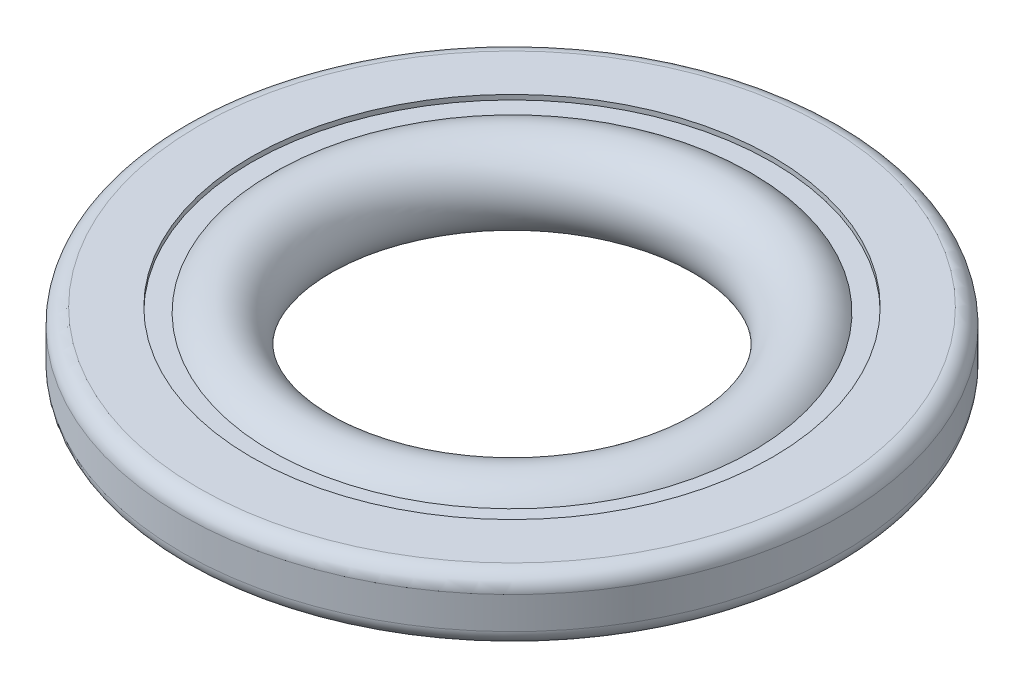
ISO-10303-21;
HEADER;
FILE_DESCRIPTION(('STEP AP214'),'2;1');
FILE_NAME('part.step','',(''),(''),'','','');
FILE_SCHEMA(('AUTOMOTIVE_DESIGN { 1 0 10303 214 1 1 1 1 }'));
ENDSEC;
DATA;
#1=APPLICATION_CONTEXT('core data for automotive mechanical design processes');
#2=APPLICATION_PROTOCOL_DEFINITION('international standard','automotive_design',2000,#1);
#3=PRODUCT_CONTEXT('',#1,'mechanical');
#4=PRODUCT('Part','Part','',(#3));
#5=PRODUCT_RELATED_PRODUCT_CATEGORY('part','',(#4));
#6=PRODUCT_DEFINITION_FORMATION('','',#4);
#7=PRODUCT_DEFINITION_CONTEXT('part definition',#1,'design');
#8=PRODUCT_DEFINITION('design','',#6,#7);
#9=PRODUCT_DEFINITION_SHAPE('','',#8);
#10=(LENGTH_UNIT() NAMED_UNIT(*) SI_UNIT(.MILLI.,.METRE.));
#11=(NAMED_UNIT(*) PLANE_ANGLE_UNIT() SI_UNIT($,.RADIAN.));
#12=(NAMED_UNIT(*) SI_UNIT($,.STERADIAN.) SOLID_ANGLE_UNIT());
#13=UNCERTAINTY_MEASURE_WITH_UNIT(LENGTH_MEASURE(1.E-05),#10,'distance_accuracy_value','');
#14=(GEOMETRIC_REPRESENTATION_CONTEXT(3) GLOBAL_UNCERTAINTY_ASSIGNED_CONTEXT((#13)) GLOBAL_UNIT_ASSIGNED_CONTEXT((#10,
#11,#12)) REPRESENTATION_CONTEXT('',''));
#15=CARTESIAN_POINT('',(0.,0.,0.));
#16=DIRECTION('',(0.,0.,1.));
#17=DIRECTION('',(1.,0.,0.));
#18=AXIS2_PLACEMENT_3D('',#15,#16,#17);
#19=CARTESIAN_POINT('',(-4.62790697674419,0.4675,0.));
#20=DIRECTION('',(0.,-1.,0.));
#21=DIRECTION('',(0.,0.,-1.));
#22=AXIS2_PLACEMENT_3D('',#19,#20,#21);
#23=PLANE('',#22);
#24=CARTESIAN_POINT('',(0.,0.4675,0.));
#25=DIRECTION('',(0.,-1.,0.));
#26=DIRECTION('',(0.,0.,-1.));
#27=AXIS2_PLACEMENT_3D('',#24,#25,#26);
#28=CIRCLE('',#27,4.62790697674419);
#29=CARTESIAN_POINT('',(0.,0.4675,-4.62790697674419));
#30=VERTEX_POINT('',#29);
#31=EDGE_CURVE('E11',#30,#30,#28,.T.);
#32=ORIENTED_EDGE('',*,*,#31,.F.);
#33=EDGE_LOOP('',(#32));
#34=FACE_BOUND('',#33,.T.);
#35=CARTESIAN_POINT('',(0.,0.4675,0.));
#36=DIRECTION('',(0.,-1.,0.));
#37=DIRECTION('',(0.,0.,-1.));
#38=AXIS2_PLACEMENT_3D('',#35,#36,#37);
#39=CIRCLE('',#38,4.12100263914879);
#40=CARTESIAN_POINT('',(0.,0.4675,-4.12100263914879));
#41=VERTEX_POINT('',#40);
#42=EDGE_CURVE('E66',#41,#41,#39,.T.);
#43=ORIENTED_EDGE('',*,*,#42,.T.);
#44=EDGE_LOOP('',(#43));
#45=FACE_BOUND('',#44,.T.);
#46=ADVANCED_FACE('F47',(#34,#45),#23,.F.);
#47=CARTESIAN_POINT('',(0.,0.,0.));
#48=DIRECTION('',(0.,-1.,0.));
#49=DIRECTION('',(0.,0.,-1.));
#50=AXIS2_PLACEMENT_3D('',#47,#48,#49);
#51=CYLINDRICAL_SURFACE('',#50,4.62790697674419);
#52=CARTESIAN_POINT('',(0.,-0.4675,0.));
#53=DIRECTION('',(0.,-1.,0.));
#54=DIRECTION('',(0.,0.,-1.));
#55=AXIS2_PLACEMENT_3D('',#52,#53,#54);
#56=CIRCLE('',#55,4.62790697674419);
#57=CARTESIAN_POINT('',(0.,-0.4675,-4.62790697674419));
#58=VERTEX_POINT('',#57);
#59=EDGE_CURVE('E57',#58,#58,#56,.T.);
#60=ORIENTED_EDGE('',*,*,#59,.F.);
#61=EDGE_LOOP('',(#60));
#62=FACE_BOUND('',#61,.T.);
#63=ORIENTED_EDGE('',*,*,#31,.T.);
#64=EDGE_LOOP('',(#63));
#65=FACE_BOUND('',#64,.T.);
#66=ADVANCED_FACE('F84',(#62,#65),#51,.T.);
#67=CARTESIAN_POINT('',(-4.62790697674419,-0.4675,0.));
#68=DIRECTION('',(0.,1.,0.));
#69=DIRECTION('',(0.,0.,1.));
#70=AXIS2_PLACEMENT_3D('',#67,#68,#69);
#71=PLANE('',#70);
#72=CARTESIAN_POINT('',(0.,-0.4675,0.));
#73=DIRECTION('',(0.,-1.,0.));
#74=DIRECTION('',(0.,0.,-1.));
#75=AXIS2_PLACEMENT_3D('',#72,#73,#74);
#76=CIRCLE('',#75,4.12100263914879);
#77=CARTESIAN_POINT('',(0.,-0.4675,-4.12100263914879));
#78=VERTEX_POINT('',#77);
#79=EDGE_CURVE('E65',#78,#78,#76,.T.);
#80=ORIENTED_EDGE('',*,*,#79,.F.);
#81=EDGE_LOOP('',(#80));
#82=FACE_BOUND('',#81,.T.);
#83=ORIENTED_EDGE('',*,*,#59,.T.);
#84=EDGE_LOOP('',(#83));
#85=FACE_BOUND('',#84,.T.);
#86=ADVANCED_FACE('F78',(#82,#85),#71,.F.);
#87=CARTESIAN_POINT('',(0.,0.,0.));
#88=DIRECTION('',(0.,-1.,0.));
#89=DIRECTION('',(0.,0.,-1.));
#90=AXIS2_PLACEMENT_3D('',#87,#88,#89);
#91=TOROIDAL_SURFACE('',#90,3.6,0.7);
#92=ORIENTED_EDGE('',*,*,#42,.F.);
#93=EDGE_LOOP('',(#92));
#94=FACE_BOUND('',#93,.T.);
#95=ORIENTED_EDGE('',*,*,#79,.T.);
#96=EDGE_LOOP('',(#95));
#97=FACE_BOUND('',#96,.T.);
#98=ADVANCED_FACE('F80',(#94,#97),#91,.T.);
#99=CLOSED_SHELL('',(#46,#66,#86,#98));
#100=MANIFOLD_SOLID_BREP('B2',#99);
#101=CARTESIAN_POINT('',(0.,0.,0.));
#102=DIRECTION('',(0.,-1.,0.));
#103=DIRECTION('',(0.,0.,-1.));
#104=AXIS2_PLACEMENT_3D('',#101,#102,#103);
#105=CYLINDRICAL_SURFACE('',#104,5.65);
#106=CARTESIAN_POINT('',(0.,0.275,0.));
#107=DIRECTION('',(0.,-1.,0.));
#108=DIRECTION('',(0.,0.,-1.));
#109=AXIS2_PLACEMENT_3D('',#106,#107,#108);
#110=CIRCLE('',#109,5.65);
#111=CARTESIAN_POINT('',(0.,0.275,-5.65));
#112=VERTEX_POINT('',#111);
#113=EDGE_CURVE('E131',#112,#112,#110,.T.);
#114=ORIENTED_EDGE('',*,*,#113,.T.);
#115=EDGE_LOOP('',(#114));
#116=FACE_BOUND('',#115,.T.);
#117=CARTESIAN_POINT('',(0.,-0.275,0.));
#118=DIRECTION('',(0.,1.,0.));
#119=DIRECTION('',(0.,0.,1.));
#120=AXIS2_PLACEMENT_3D('',#117,#118,#119);
#121=CIRCLE('',#120,5.65);
#122=CARTESIAN_POINT('',(0.,-0.275,5.65));
#123=VERTEX_POINT('',#122);
#124=EDGE_CURVE('E137',#123,#123,#121,.T.);
#125=ORIENTED_EDGE('',*,*,#124,.T.);
#126=EDGE_LOOP('',(#125));
#127=FACE_BOUND('',#126,.T.);
#128=ADVANCED_FACE('F118',(#116,#127),#105,.T.);
#129=CARTESIAN_POINT('',(-4.46395348837209,-0.55,0.));
#130=DIRECTION('',(0.,1.,0.));
#131=DIRECTION('',(0.,0.,1.));
#132=AXIS2_PLACEMENT_3D('',#129,#130,#131);
#133=PLANE('',#132);
#134=CARTESIAN_POINT('',(0.,-0.55,0.));
#135=DIRECTION('',(0.,1.,0.));
#136=DIRECTION('',(0.,0.,1.));
#137=AXIS2_PLACEMENT_3D('',#134,#135,#136);
#138=CIRCLE('',#137,5.375);
#139=CARTESIAN_POINT('',(0.,-0.55,5.375));
#140=VERTEX_POINT('',#139);
#141=EDGE_CURVE('E48',#140,#140,#138,.F.);
#142=ORIENTED_EDGE('',*,*,#141,.T.);
#143=EDGE_LOOP('',(#142));
#144=FACE_BOUND('',#143,.T.);
#145=CARTESIAN_POINT('',(0.,-0.55,0.));
#146=DIRECTION('',(0.,-1.,0.));
#147=DIRECTION('',(0.,0.,-1.));
#148=AXIS2_PLACEMENT_3D('',#145,#146,#147);
#149=CIRCLE('',#148,4.46395348837209);
#150=CARTESIAN_POINT('',(0.,-0.55,-4.46395348837209));
#151=VERTEX_POINT('',#150);
#152=EDGE_CURVE('E143',#151,#151,#149,.T.);
#153=ORIENTED_EDGE('',*,*,#152,.F.);
#154=EDGE_LOOP('',(#153));
#155=FACE_BOUND('',#154,.T.);
#156=ADVANCED_FACE('F199',(#144,#155),#133,.F.);
#157=CARTESIAN_POINT('',(0.,0.,0.));
#158=DIRECTION('',(0.,-1.,0.));
#159=DIRECTION('',(0.,0.,-1.));
#160=AXIS2_PLACEMENT_3D('',#157,#158,#159);
#161=CYLINDRICAL_SURFACE('',#160,4.46395348837209);
#162=CARTESIAN_POINT('',(0.,-0.4675,0.));
#163=DIRECTION('',(0.,-1.,0.));
#164=DIRECTION('',(0.,0.,-1.));
#165=AXIS2_PLACEMENT_3D('',#162,#163,#164);
#166=CIRCLE('',#165,4.46395348837209);
#167=CARTESIAN_POINT('',(0.,-0.4675,-4.46395348837209));
#168=VERTEX_POINT('',#167);
#169=EDGE_CURVE('E148',#168,#168,#166,.T.);
#170=ORIENTED_EDGE('',*,*,#169,.F.);
#171=EDGE_LOOP('',(#170));
#172=FACE_BOUND('',#171,.T.);
#173=ORIENTED_EDGE('',*,*,#152,.T.);
#174=EDGE_LOOP('',(#173));
#175=FACE_BOUND('',#174,.T.);
#176=ADVANCED_FACE('F193',(#172,#175),#161,.F.);
#177=CARTESIAN_POINT('',(-4.62790697674419,-0.4675,0.));
#178=DIRECTION('',(0.,-1.,0.));
#179=DIRECTION('',(0.,0.,-1.));
#180=AXIS2_PLACEMENT_3D('',#177,#178,#179);
#181=PLANE('',#180);
#182=CARTESIAN_POINT('',(0.,-0.4675,0.));
#183=DIRECTION('',(0.,-1.,0.));
#184=DIRECTION('',(0.,0.,-1.));
#185=AXIS2_PLACEMENT_3D('',#182,#183,#184);
#186=CIRCLE('',#185,4.62790697674419);
#187=CARTESIAN_POINT('',(0.,-0.4675,-4.62790697674419));
#188=VERTEX_POINT('',#187);
#189=EDGE_CURVE('E151',#188,#188,#186,.T.);
#190=ORIENTED_EDGE('',*,*,#189,.F.);
#191=EDGE_LOOP('',(#190));
#192=FACE_BOUND('',#191,.T.);
#193=ORIENTED_EDGE('',*,*,#169,.T.);
#194=EDGE_LOOP('',(#193));
#195=FACE_BOUND('',#194,.T.);
#196=ADVANCED_FACE('F189',(#192,#195),#181,.F.);
#197=CARTESIAN_POINT('',(0.,0.,0.));
#198=DIRECTION('',(0.,-1.,0.));
#199=DIRECTION('',(0.,0.,-1.));
#200=AXIS2_PLACEMENT_3D('',#197,#198,#199);
#201=CYLINDRICAL_SURFACE('',#200,4.62790697674419);
#202=CARTESIAN_POINT('',(0.,0.4675,0.));
#203=DIRECTION('',(0.,-1.,0.));
#204=DIRECTION('',(0.,0.,-1.));
#205=AXIS2_PLACEMENT_3D('',#202,#203,#204);
#206=CIRCLE('',#205,4.62790697674419);
#207=CARTESIAN_POINT('',(0.,0.4675,-4.62790697674419));
#208=VERTEX_POINT('',#207);
#209=EDGE_CURVE('E159',#208,#208,#206,.T.);
#210=ORIENTED_EDGE('',*,*,#209,.F.);
#211=EDGE_LOOP('',(#210));
#212=FACE_BOUND('',#211,.T.);
#213=ORIENTED_EDGE('',*,*,#189,.T.);
#214=EDGE_LOOP('',(#213));
#215=FACE_BOUND('',#214,.T.);
#216=ADVANCED_FACE('F185',(#212,#215),#201,.F.);
#217=CARTESIAN_POINT('',(-4.46395348837209,0.4675,0.));
#218=DIRECTION('',(0.,1.,0.));
#219=DIRECTION('',(0.,0.,1.));
#220=AXIS2_PLACEMENT_3D('',#217,#218,#219);
#221=PLANE('',#220);
#222=CARTESIAN_POINT('',(0.,0.4675,0.));
#223=DIRECTION('',(0.,-1.,0.));
#224=DIRECTION('',(0.,0.,-1.));
#225=AXIS2_PLACEMENT_3D('',#222,#223,#224);
#226=CIRCLE('',#225,4.46395348837209);
#227=CARTESIAN_POINT('',(0.,0.4675,-4.46395348837209));
#228=VERTEX_POINT('',#227);
#229=EDGE_CURVE('E163',#228,#228,#226,.T.);
#230=ORIENTED_EDGE('',*,*,#229,.F.);
#231=EDGE_LOOP('',(#230));
#232=FACE_BOUND('',#231,.T.);
#233=ORIENTED_EDGE('',*,*,#209,.T.);
#234=EDGE_LOOP('',(#233));
#235=FACE_BOUND('',#234,.T.);
#236=ADVANCED_FACE('F176',(#232,#235),#221,.F.);
#237=CARTESIAN_POINT('',(0.,0.,0.));
#238=DIRECTION('',(0.,-1.,0.));
#239=DIRECTION('',(0.,0.,-1.));
#240=AXIS2_PLACEMENT_3D('',#237,#238,#239);
#241=CYLINDRICAL_SURFACE('',#240,4.46395348837209);
#242=CARTESIAN_POINT('',(0.,0.55,0.));
#243=DIRECTION('',(0.,-1.,0.));
#244=DIRECTION('',(0.,0.,-1.));
#245=AXIS2_PLACEMENT_3D('',#242,#243,#244);
#246=CIRCLE('',#245,4.46395348837209);
#247=CARTESIAN_POINT('',(0.,0.55,-4.46395348837209));
#248=VERTEX_POINT('',#247);
#249=EDGE_CURVE('E164',#248,#248,#246,.T.);
#250=ORIENTED_EDGE('',*,*,#249,.F.);
#251=EDGE_LOOP('',(#250));
#252=FACE_BOUND('',#251,.T.);
#253=ORIENTED_EDGE('',*,*,#229,.T.);
#254=EDGE_LOOP('',(#253));
#255=FACE_BOUND('',#254,.T.);
#256=ADVANCED_FACE('F173',(#252,#255),#241,.F.);
#257=CARTESIAN_POINT('',(-5.65,0.55,0.));
#258=DIRECTION('',(0.,-1.,0.));
#259=DIRECTION('',(0.,0.,-1.));
#260=AXIS2_PLACEMENT_3D('',#257,#258,#259);
#261=PLANE('',#260);
#262=CARTESIAN_POINT('',(0.,0.55,0.));
#263=DIRECTION('',(0.,-1.,0.));
#264=DIRECTION('',(0.,0.,-1.));
#265=AXIS2_PLACEMENT_3D('',#262,#263,#264);
#266=CIRCLE('',#265,5.375);
#267=CARTESIAN_POINT('',(0.,0.55,-5.375));
#268=VERTEX_POINT('',#267);
#269=EDGE_CURVE('E130',#268,#268,#266,.F.);
#270=ORIENTED_EDGE('',*,*,#269,.T.);
#271=EDGE_LOOP('',(#270));
#272=FACE_BOUND('',#271,.T.);
#273=ORIENTED_EDGE('',*,*,#249,.T.);
#274=EDGE_LOOP('',(#273));
#275=FACE_BOUND('',#274,.T.);
#276=ADVANCED_FACE('F171',(#272,#275),#261,.F.);
#277=CARTESIAN_POINT('',(0.,0.275,0.));
#278=DIRECTION('',(0.,-1.,0.));
#279=DIRECTION('',(0.,0.,-1.));
#280=AXIS2_PLACEMENT_3D('',#277,#278,#279);
#281=TOROIDAL_SURFACE('',#280,5.375,0.275);
#282=ORIENTED_EDGE('',*,*,#269,.F.);
#283=EDGE_LOOP('',(#282));
#284=FACE_BOUND('',#283,.T.);
#285=ORIENTED_EDGE('',*,*,#113,.F.);
#286=EDGE_LOOP('',(#285));
#287=FACE_BOUND('',#286,.T.);
#288=ADVANCED_FACE('F211',(#284,#287),#281,.T.);
#289=CARTESIAN_POINT('',(0.,-0.275,0.));
#290=DIRECTION('',(0.,1.,0.));
#291=DIRECTION('',(0.,0.,1.));
#292=AXIS2_PLACEMENT_3D('',#289,#290,#291);
#293=TOROIDAL_SURFACE('',#292,5.375,0.275);
#294=ORIENTED_EDGE('',*,*,#124,.F.);
#295=EDGE_LOOP('',(#294));
#296=FACE_BOUND('',#295,.T.);
#297=ORIENTED_EDGE('',*,*,#141,.F.);
#298=EDGE_LOOP('',(#297));
#299=FACE_BOUND('',#298,.T.);
#300=ADVANCED_FACE('F122',(#296,#299),#293,.T.);
#301=CLOSED_SHELL('',(#128,#156,#176,#196,#216,#236,#256,#276,#288,#300));
#302=MANIFOLD_SOLID_BREP('B6',#301);
#303=ADVANCED_BREP_SHAPE_REPRESENTATION('',(#18,#100,#302),#14);
#304=SHAPE_DEFINITION_REPRESENTATION(#9,#303);
ENDSEC;
END-ISO-10303-21;
